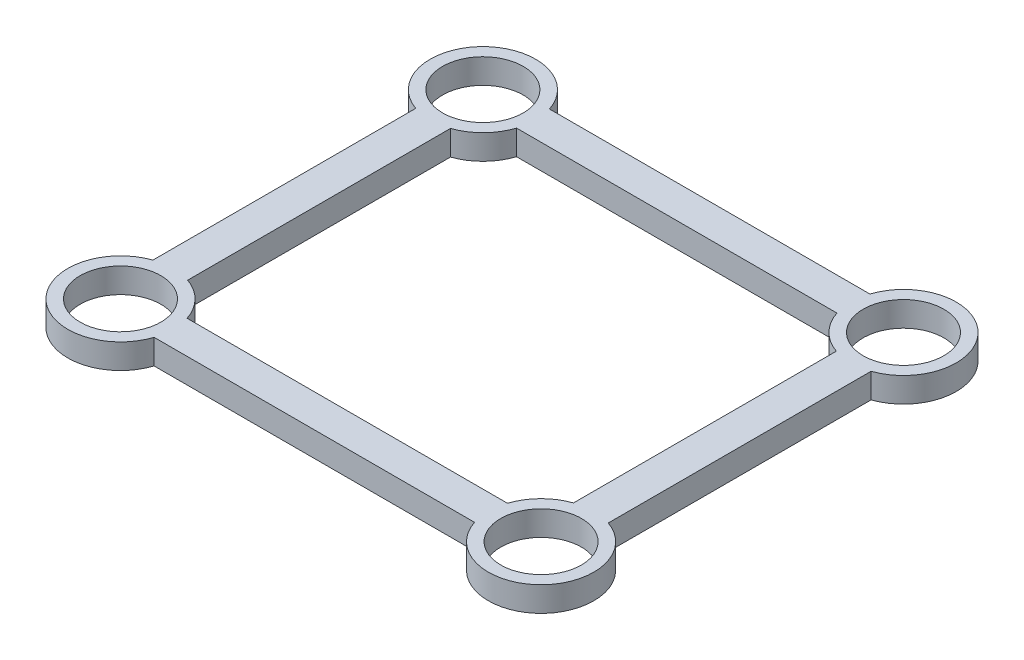
ISO-10303-21;
HEADER;
FILE_DESCRIPTION(('STEP AP214'),'2;1');
FILE_NAME('part.step','',(''),(''),'','','');
FILE_SCHEMA(('AUTOMOTIVE_DESIGN { 1 0 10303 214 1 1 1 1 }'));
ENDSEC;
DATA;
#1=APPLICATION_CONTEXT('core data for automotive mechanical design processes');
#2=APPLICATION_PROTOCOL_DEFINITION('international standard','automotive_design',2000,#1);
#3=PRODUCT_CONTEXT('',#1,'mechanical');
#4=PRODUCT('Part','Part','',(#3));
#5=PRODUCT_RELATED_PRODUCT_CATEGORY('part','',(#4));
#6=PRODUCT_DEFINITION_FORMATION('','',#4);
#7=PRODUCT_DEFINITION_CONTEXT('part definition',#1,'design');
#8=PRODUCT_DEFINITION('design','',#6,#7);
#9=PRODUCT_DEFINITION_SHAPE('','',#8);
#10=(LENGTH_UNIT() NAMED_UNIT(*) SI_UNIT(.MILLI.,.METRE.));
#11=(NAMED_UNIT(*) PLANE_ANGLE_UNIT() SI_UNIT($,.RADIAN.));
#12=(NAMED_UNIT(*) SI_UNIT($,.STERADIAN.) SOLID_ANGLE_UNIT());
#13=UNCERTAINTY_MEASURE_WITH_UNIT(LENGTH_MEASURE(1.E-05),#10,'distance_accuracy_value','');
#14=(GEOMETRIC_REPRESENTATION_CONTEXT(3) GLOBAL_UNCERTAINTY_ASSIGNED_CONTEXT((#13)) GLOBAL_UNIT_ASSIGNED_CONTEXT((#10,
#11,#12)) REPRESENTATION_CONTEXT('',''));
#15=CARTESIAN_POINT('',(0.,0.,0.));
#16=DIRECTION('',(0.,0.,1.));
#17=DIRECTION('',(1.,0.,0.));
#18=AXIS2_PLACEMENT_3D('',#15,#16,#17);
#19=CARTESIAN_POINT('',(-18.5199168614661,2.54,18.7952583208536));
#20=DIRECTION('',(0.,-1.,0.));
#21=DIRECTION('',(0.,0.,-1.));
#22=AXIS2_PLACEMENT_3D('',#19,#20,#21);
#23=CYLINDRICAL_SURFACE('',#22,5.3975);
#24=CARTESIAN_POINT('',(-18.5199168614661,0.,18.7952583208536));
#25=DIRECTION('',(0.,1.,0.));
#26=DIRECTION('',(0.,0.,1.));
#27=AXIS2_PLACEMENT_3D('',#24,#25,#26);
#28=CIRCLE('',#27,5.3975);
#29=CARTESIAN_POINT('',(-13.392735754035,0.,20.4819770708536));
#30=VERTEX_POINT('',#29);
#31=CARTESIAN_POINT('',(-20.298585882467,0.,13.699245883297));
#32=VERTEX_POINT('',#31);
#33=EDGE_CURVE('E233',#30,#32,#28,.F.);
#34=ORIENTED_EDGE('',*,*,#33,.F.);
#35=DIRECTION('',(0.,-1.,0.));
#36=VECTOR('',#35,1.);
#37=CARTESIAN_POINT('',(-13.392735754035,2.54,20.4819770708536));
#38=LINE('',#37,#36);
#39=CARTESIAN_POINT('',(-13.392735754035,2.54,20.4819770708536));
#40=VERTEX_POINT('',#39);
#41=EDGE_CURVE('E13',#40,#30,#38,.T.);
#42=ORIENTED_EDGE('',*,*,#41,.F.);
#43=CARTESIAN_POINT('',(-18.5199168614661,2.54,18.7952583208536));
#44=DIRECTION('',(0.,1.,0.));
#45=DIRECTION('',(0.,0.,1.));
#46=AXIS2_PLACEMENT_3D('',#43,#44,#45);
#47=CIRCLE('',#46,5.3975);
#48=CARTESIAN_POINT('',(-20.298585882467,2.54,13.699245883297));
#49=VERTEX_POINT('',#48);
#50=EDGE_CURVE('E324',#40,#49,#47,.F.);
#51=ORIENTED_EDGE('',*,*,#50,.T.);
#52=DIRECTION('',(0.,-1.,0.));
#53=VECTOR('',#52,1.);
#54=CARTESIAN_POINT('',(-20.298585882467,2.54,13.699245883297));
#55=LINE('',#54,#53);
#56=EDGE_CURVE('E123',#49,#32,#55,.T.);
#57=ORIENTED_EDGE('',*,*,#56,.T.);
#58=EDGE_LOOP('',(#34,#42,#51,#57));
#59=FACE_BOUND('',#58,.T.);
#60=ADVANCED_FACE('F45',(#59),#23,.T.);
#61=CARTESIAN_POINT('',(0.,2.54,20.4819770708536));
#62=DIRECTION('',(0.,0.,-1.));
#63=DIRECTION('',(-1.,0.,0.));
#64=AXIS2_PLACEMENT_3D('',#61,#62,#63);
#65=PLANE('',#64);
#66=DIRECTION('',(1.,0.,0.));
#67=VECTOR('',#66,1.);
#68=CARTESIAN_POINT('',(0.,0.,20.4819770708536));
#69=LINE('',#68,#67);
#70=CARTESIAN_POINT('',(19.3890567511028,0.,20.4819770708536));
#71=VERTEX_POINT('',#70);
#72=EDGE_CURVE('E235',#30,#71,#69,.T.);
#73=ORIENTED_EDGE('',*,*,#72,.T.);
#74=DIRECTION('',(0.,-1.,0.));
#75=VECTOR('',#74,1.);
#76=CARTESIAN_POINT('',(19.3890567511028,2.54,20.4819770708536));
#77=LINE('',#76,#75);
#78=CARTESIAN_POINT('',(19.3890567511028,2.54,20.4819770708536));
#79=VERTEX_POINT('',#78);
#80=EDGE_CURVE('E55',#79,#71,#77,.T.);
#81=ORIENTED_EDGE('',*,*,#80,.F.);
#82=DIRECTION('',(1.,0.,0.));
#83=VECTOR('',#82,1.);
#84=CARTESIAN_POINT('',(0.,2.54,20.4819770708536));
#85=LINE('',#84,#83);
#86=EDGE_CURVE('E326',#40,#79,#85,.T.);
#87=ORIENTED_EDGE('',*,*,#86,.F.);
#88=ORIENTED_EDGE('',*,*,#41,.T.);
#89=EDGE_LOOP('',(#73,#81,#87,#88));
#90=FACE_BOUND('',#89,.T.);
#91=ADVANCED_FACE('F362',(#90),#65,.F.);
#92=CARTESIAN_POINT('',(24.5162378585339,2.54,18.7952583208536));
#93=DIRECTION('',(0.,-1.,0.));
#94=DIRECTION('',(0.,0.,-1.));
#95=AXIS2_PLACEMENT_3D('',#92,#93,#94);
#96=CYLINDRICAL_SURFACE('',#95,5.3975);
#97=CARTESIAN_POINT('',(24.5162378585339,0.,18.7952583208536));
#98=DIRECTION('',(0.,1.,0.));
#99=DIRECTION('',(0.,0.,1.));
#100=AXIS2_PLACEMENT_3D('',#97,#98,#99);
#101=CIRCLE('',#100,5.3975);
#102=CARTESIAN_POINT('',(26.2949068795348,0.,13.699245883297));
#103=VERTEX_POINT('',#102);
#104=EDGE_CURVE('E238',#71,#103,#101,.T.);
#105=ORIENTED_EDGE('',*,*,#104,.T.);
#106=DIRECTION('',(0.,-1.,0.));
#107=VECTOR('',#106,1.);
#108=CARTESIAN_POINT('',(26.2949068795348,2.54,13.699245883297));
#109=LINE('',#108,#107);
#110=CARTESIAN_POINT('',(26.2949068795348,2.54,13.699245883297));
#111=VERTEX_POINT('',#110);
#112=EDGE_CURVE('E263',#111,#103,#109,.T.);
#113=ORIENTED_EDGE('',*,*,#112,.F.);
#114=CARTESIAN_POINT('',(24.5162378585339,2.54,18.7952583208536));
#115=DIRECTION('',(0.,1.,0.));
#116=DIRECTION('',(0.,0.,1.));
#117=AXIS2_PLACEMENT_3D('',#114,#115,#116);
#118=CIRCLE('',#117,5.3975);
#119=EDGE_CURVE('E329',#79,#111,#118,.T.);
#120=ORIENTED_EDGE('',*,*,#119,.F.);
#121=ORIENTED_EDGE('',*,*,#80,.T.);
#122=EDGE_LOOP('',(#105,#113,#120,#121));
#123=FACE_BOUND('',#122,.T.);
#124=ADVANCED_FACE('F367',(#123),#96,.T.);
#125=CARTESIAN_POINT('',(26.2949068795348,2.54,0.));
#126=DIRECTION('',(1.,0.,0.));
#127=DIRECTION('',(0.,0.,-1.));
#128=AXIS2_PLACEMENT_3D('',#125,#126,#127);
#129=PLANE('',#128);
#130=DIRECTION('',(0.,0.,1.));
#131=VECTOR('',#130,1.);
#132=CARTESIAN_POINT('',(26.2949068795348,0.,0.));
#133=LINE('',#132,#131);
#134=CARTESIAN_POINT('',(26.2949068795348,0.,-13.1927292415898));
#135=VERTEX_POINT('',#134);
#136=EDGE_CURVE('E241',#135,#103,#133,.T.);
#137=ORIENTED_EDGE('',*,*,#136,.F.);
#138=DIRECTION('',(0.,-1.,0.));
#139=VECTOR('',#138,1.);
#140=CARTESIAN_POINT('',(26.2949068795348,2.54,-13.1927292415898));
#141=LINE('',#140,#139);
#142=CARTESIAN_POINT('',(26.2949068795348,2.54,-13.1927292415898));
#143=VERTEX_POINT('',#142);
#144=EDGE_CURVE('E261',#143,#135,#141,.T.);
#145=ORIENTED_EDGE('',*,*,#144,.F.);
#146=DIRECTION('',(0.,0.,1.));
#147=VECTOR('',#146,1.);
#148=CARTESIAN_POINT('',(26.2949068795348,2.54,0.));
#149=LINE('',#148,#147);
#150=EDGE_CURVE('E193',#143,#111,#149,.T.);
#151=ORIENTED_EDGE('',*,*,#150,.T.);
#152=ORIENTED_EDGE('',*,*,#112,.T.);
#153=EDGE_LOOP('',(#137,#145,#151,#152));
#154=FACE_BOUND('',#153,.T.);
#155=ADVANCED_FACE('F333',(#154),#129,.T.);
#156=CARTESIAN_POINT('',(24.5162378585339,2.54,-18.2887416791464));
#157=DIRECTION('',(0.,-1.,0.));
#158=DIRECTION('',(0.,0.,-1.));
#159=AXIS2_PLACEMENT_3D('',#156,#157,#158);
#160=CYLINDRICAL_SURFACE('',#159,5.3975);
#161=CARTESIAN_POINT('',(24.5162378585339,0.,-18.2887416791464));
#162=DIRECTION('',(0.,1.,0.));
#163=DIRECTION('',(0.,0.,1.));
#164=AXIS2_PLACEMENT_3D('',#161,#162,#163);
#165=CIRCLE('',#164,5.3975);
#166=CARTESIAN_POINT('',(19.3890567511028,0.,-19.9754604291464));
#167=VERTEX_POINT('',#166);
#168=EDGE_CURVE('E244',#167,#135,#165,.F.);
#169=ORIENTED_EDGE('',*,*,#168,.F.);
#170=DIRECTION('',(0.,-1.,0.));
#171=VECTOR('',#170,1.);
#172=CARTESIAN_POINT('',(19.3890567511028,2.54,-19.9754604291464));
#173=LINE('',#172,#171);
#174=CARTESIAN_POINT('',(19.3890567511028,2.54,-19.9754604291464));
#175=VERTEX_POINT('',#174);
#176=EDGE_CURVE('E179',#175,#167,#173,.T.);
#177=ORIENTED_EDGE('',*,*,#176,.F.);
#178=CARTESIAN_POINT('',(24.5162378585339,2.54,-18.2887416791464));
#179=DIRECTION('',(0.,1.,0.));
#180=DIRECTION('',(0.,0.,1.));
#181=AXIS2_PLACEMENT_3D('',#178,#179,#180);
#182=CIRCLE('',#181,5.3975);
#183=EDGE_CURVE('E191',#175,#143,#182,.F.);
#184=ORIENTED_EDGE('',*,*,#183,.T.);
#185=ORIENTED_EDGE('',*,*,#144,.T.);
#186=EDGE_LOOP('',(#169,#177,#184,#185));
#187=FACE_BOUND('',#186,.T.);
#188=ADVANCED_FACE('F337',(#187),#160,.T.);
#189=CARTESIAN_POINT('',(0.,2.54,-19.9754604291464));
#190=DIRECTION('',(0.,0.,-1.));
#191=DIRECTION('',(-1.,0.,0.));
#192=AXIS2_PLACEMENT_3D('',#189,#190,#191);
#193=PLANE('',#192);
#194=DIRECTION('',(1.,0.,0.));
#195=VECTOR('',#194,1.);
#196=CARTESIAN_POINT('',(0.,0.,-19.9754604291464));
#197=LINE('',#196,#195);
#198=CARTESIAN_POINT('',(-13.392735754035,0.,-19.9754604291464));
#199=VERTEX_POINT('',#198);
#200=EDGE_CURVE('E176',#199,#167,#197,.T.);
#201=ORIENTED_EDGE('',*,*,#200,.F.);
#202=DIRECTION('',(0.,-1.,0.));
#203=VECTOR('',#202,1.);
#204=CARTESIAN_POINT('',(-13.392735754035,2.54,-19.9754604291464));
#205=LINE('',#204,#203);
#206=CARTESIAN_POINT('',(-13.392735754035,2.54,-19.9754604291464));
#207=VERTEX_POINT('',#206);
#208=EDGE_CURVE('E170',#207,#199,#205,.T.);
#209=ORIENTED_EDGE('',*,*,#208,.F.);
#210=DIRECTION('',(1.,0.,0.));
#211=VECTOR('',#210,1.);
#212=CARTESIAN_POINT('',(0.,2.54,-19.9754604291464));
#213=LINE('',#212,#211);
#214=EDGE_CURVE('E174',#207,#175,#213,.T.);
#215=ORIENTED_EDGE('',*,*,#214,.T.);
#216=ORIENTED_EDGE('',*,*,#176,.T.);
#217=EDGE_LOOP('',(#201,#209,#215,#216));
#218=FACE_BOUND('',#217,.T.);
#219=ADVANCED_FACE('F172',(#218),#193,.T.);
#220=CARTESIAN_POINT('',(-18.5199168614661,2.54,-18.2887416791464));
#221=DIRECTION('',(0.,-1.,0.));
#222=DIRECTION('',(0.,0.,-1.));
#223=AXIS2_PLACEMENT_3D('',#220,#221,#222);
#224=CYLINDRICAL_SURFACE('',#223,5.3975);
#225=CARTESIAN_POINT('',(-18.5199168614661,0.,-18.2887416791464));
#226=DIRECTION('',(0.,1.,0.));
#227=DIRECTION('',(0.,0.,1.));
#228=AXIS2_PLACEMENT_3D('',#225,#226,#227);
#229=CIRCLE('',#228,5.3975);
#230=CARTESIAN_POINT('',(-20.298585882467,0.,-13.1927292415898));
#231=VERTEX_POINT('',#230);
#232=EDGE_CURVE('E248',#199,#231,#229,.T.);
#233=ORIENTED_EDGE('',*,*,#232,.T.);
#234=DIRECTION('',(0.,-1.,0.));
#235=VECTOR('',#234,1.);
#236=CARTESIAN_POINT('',(-20.298585882467,2.54,-13.1927292415898));
#237=LINE('',#236,#235);
#238=CARTESIAN_POINT('',(-20.298585882467,2.54,-13.1927292415898));
#239=VERTEX_POINT('',#238);
#240=EDGE_CURVE('E180',#239,#231,#237,.T.);
#241=ORIENTED_EDGE('',*,*,#240,.F.);
#242=CARTESIAN_POINT('',(-18.5199168614661,2.54,-18.2887416791464));
#243=DIRECTION('',(0.,1.,0.));
#244=DIRECTION('',(0.,0.,1.));
#245=AXIS2_PLACEMENT_3D('',#242,#243,#244);
#246=CIRCLE('',#245,5.3975);
#247=EDGE_CURVE('E183',#207,#239,#246,.T.);
#248=ORIENTED_EDGE('',*,*,#247,.F.);
#249=ORIENTED_EDGE('',*,*,#208,.T.);
#250=EDGE_LOOP('',(#233,#241,#248,#249));
#251=FACE_BOUND('',#250,.T.);
#252=ADVANCED_FACE('F184',(#251),#224,.T.);
#253=CARTESIAN_POINT('',(-18.5199168614661,2.54,18.7952583208536));
#254=DIRECTION('',(0.,-1.,0.));
#255=DIRECTION('',(0.,0.,-1.));
#256=AXIS2_PLACEMENT_3D('',#253,#254,#255);
#257=CYLINDRICAL_SURFACE('',#256,5.3975);
#258=CARTESIAN_POINT('',(-18.5199168614661,0.,18.7952583208536));
#259=DIRECTION('',(0.,1.,0.));
#260=DIRECTION('',(0.,0.,1.));
#261=AXIS2_PLACEMENT_3D('',#258,#259,#260);
#262=CIRCLE('',#261,5.3975);
#263=CARTESIAN_POINT('',(-16.7412478404652,0.,13.699245883297));
#264=VERTEX_POINT('',#263);
#265=CARTESIAN_POINT('',(-13.392735754035,0.,17.1085395708536));
#266=VERTEX_POINT('',#265);
#267=EDGE_CURVE('E205',#264,#266,#262,.F.);
#268=ORIENTED_EDGE('',*,*,#267,.F.);
#269=DIRECTION('',(0.,-1.,0.));
#270=VECTOR('',#269,1.);
#271=CARTESIAN_POINT('',(-16.7412478404652,2.54,13.699245883297));
#272=LINE('',#271,#270);
#273=CARTESIAN_POINT('',(-16.7412478404652,2.54,13.699245883297));
#274=VERTEX_POINT('',#273);
#275=EDGE_CURVE('E49',#274,#264,#272,.T.);
#276=ORIENTED_EDGE('',*,*,#275,.F.);
#277=CARTESIAN_POINT('',(-18.5199168614661,2.54,18.7952583208536));
#278=DIRECTION('',(0.,1.,0.));
#279=DIRECTION('',(0.,0.,1.));
#280=AXIS2_PLACEMENT_3D('',#277,#278,#279);
#281=CIRCLE('',#280,5.3975);
#282=CARTESIAN_POINT('',(-13.392735754035,2.54,17.1085395708536));
#283=VERTEX_POINT('',#282);
#284=EDGE_CURVE('E257',#274,#283,#281,.F.);
#285=ORIENTED_EDGE('',*,*,#284,.T.);
#286=DIRECTION('',(0.,-1.,0.));
#287=VECTOR('',#286,1.);
#288=CARTESIAN_POINT('',(-13.392735754035,2.54,17.1085395708536));
#289=LINE('',#288,#287);
#290=EDGE_CURVE('E204',#283,#266,#289,.T.);
#291=ORIENTED_EDGE('',*,*,#290,.T.);
#292=EDGE_LOOP('',(#268,#276,#285,#291));
#293=FACE_BOUND('',#292,.T.);
#294=ADVANCED_FACE('F47',(#293),#257,.T.);
#295=CARTESIAN_POINT('',(-16.7412478404652,2.54,0.));
#296=DIRECTION('',(1.,0.,0.));
#297=DIRECTION('',(0.,0.,-1.));
#298=AXIS2_PLACEMENT_3D('',#295,#296,#297);
#299=PLANE('',#298);
#300=DIRECTION('',(0.,0.,1.));
#301=VECTOR('',#300,1.);
#302=CARTESIAN_POINT('',(-16.7412478404652,0.,0.));
#303=LINE('',#302,#301);
#304=CARTESIAN_POINT('',(-16.7412478404652,0.,-13.1927292415898));
#305=VERTEX_POINT('',#304);
#306=EDGE_CURVE('E208',#305,#264,#303,.T.);
#307=ORIENTED_EDGE('',*,*,#306,.F.);
#308=DIRECTION('',(0.,-1.,0.));
#309=VECTOR('',#308,1.);
#310=CARTESIAN_POINT('',(-16.7412478404652,2.54,-13.1927292415898));
#311=LINE('',#310,#309);
#312=CARTESIAN_POINT('',(-16.7412478404652,2.54,-13.1927292415898));
#313=VERTEX_POINT('',#312);
#314=EDGE_CURVE('E279',#313,#305,#311,.T.);
#315=ORIENTED_EDGE('',*,*,#314,.F.);
#316=DIRECTION('',(0.,0.,1.));
#317=VECTOR('',#316,1.);
#318=CARTESIAN_POINT('',(-16.7412478404652,2.54,0.));
#319=LINE('',#318,#317);
#320=EDGE_CURVE('E288',#313,#274,#319,.T.);
#321=ORIENTED_EDGE('',*,*,#320,.T.);
#322=ORIENTED_EDGE('',*,*,#275,.T.);
#323=EDGE_LOOP('',(#307,#315,#321,#322));
#324=FACE_BOUND('',#323,.T.);
#325=ADVANCED_FACE('F286',(#324),#299,.T.);
#326=CARTESIAN_POINT('',(-18.5199168614661,2.54,-18.2887416791464));
#327=DIRECTION('',(0.,-1.,0.));
#328=DIRECTION('',(0.,0.,-1.));
#329=AXIS2_PLACEMENT_3D('',#326,#327,#328);
#330=CYLINDRICAL_SURFACE('',#329,5.3975);
#331=CARTESIAN_POINT('',(-18.5199168614661,0.,-18.2887416791464));
#332=DIRECTION('',(0.,1.,0.));
#333=DIRECTION('',(0.,0.,1.));
#334=AXIS2_PLACEMENT_3D('',#331,#332,#333);
#335=CIRCLE('',#334,5.3975);
#336=CARTESIAN_POINT('',(-13.392735754035,0.,-16.6020229291464));
#337=VERTEX_POINT('',#336);
#338=EDGE_CURVE('E211',#305,#337,#335,.T.);
#339=ORIENTED_EDGE('',*,*,#338,.T.);
#340=DIRECTION('',(0.,-1.,0.));
#341=VECTOR('',#340,1.);
#342=CARTESIAN_POINT('',(-13.392735754035,2.54,-16.6020229291464));
#343=LINE('',#342,#341);
#344=CARTESIAN_POINT('',(-13.392735754035,2.54,-16.6020229291464));
#345=VERTEX_POINT('',#344);
#346=EDGE_CURVE('E277',#345,#337,#343,.T.);
#347=ORIENTED_EDGE('',*,*,#346,.F.);
#348=CARTESIAN_POINT('',(-18.5199168614661,2.54,-18.2887416791464));
#349=DIRECTION('',(0.,1.,0.));
#350=DIRECTION('',(0.,0.,1.));
#351=AXIS2_PLACEMENT_3D('',#348,#349,#350);
#352=CIRCLE('',#351,5.3975);
#353=EDGE_CURVE('E305',#313,#345,#352,.T.);
#354=ORIENTED_EDGE('',*,*,#353,.F.);
#355=ORIENTED_EDGE('',*,*,#314,.T.);
#356=EDGE_LOOP('',(#339,#347,#354,#355));
#357=FACE_BOUND('',#356,.T.);
#358=ADVANCED_FACE('F295',(#357),#330,.T.);
#359=CARTESIAN_POINT('',(0.,2.54,-16.6020229291464));
#360=DIRECTION('',(0.,0.,-1.));
#361=DIRECTION('',(-1.,0.,0.));
#362=AXIS2_PLACEMENT_3D('',#359,#360,#361);
#363=PLANE('',#362);
#364=DIRECTION('',(1.,0.,0.));
#365=VECTOR('',#364,1.);
#366=CARTESIAN_POINT('',(0.,0.,-16.6020229291464));
#367=LINE('',#366,#365);
#368=CARTESIAN_POINT('',(19.3890567511028,0.,-16.6020229291464));
#369=VERTEX_POINT('',#368);
#370=EDGE_CURVE('E213',#337,#369,#367,.T.);
#371=ORIENTED_EDGE('',*,*,#370,.T.);
#372=DIRECTION('',(0.,-1.,0.));
#373=VECTOR('',#372,1.);
#374=CARTESIAN_POINT('',(19.3890567511028,2.54,-16.6020229291464));
#375=LINE('',#374,#373);
#376=CARTESIAN_POINT('',(19.3890567511028,2.54,-16.6020229291464));
#377=VERTEX_POINT('',#376);
#378=EDGE_CURVE('E275',#377,#369,#375,.T.);
#379=ORIENTED_EDGE('',*,*,#378,.F.);
#380=DIRECTION('',(1.,0.,0.));
#381=VECTOR('',#380,1.);
#382=CARTESIAN_POINT('',(0.,2.54,-16.6020229291464));
#383=LINE('',#382,#381);
#384=EDGE_CURVE('E300',#345,#377,#383,.T.);
#385=ORIENTED_EDGE('',*,*,#384,.F.);
#386=ORIENTED_EDGE('',*,*,#346,.T.);
#387=EDGE_LOOP('',(#371,#379,#385,#386));
#388=FACE_BOUND('',#387,.T.);
#389=ADVANCED_FACE('F298',(#388),#363,.F.);
#390=CARTESIAN_POINT('',(24.5162378585339,2.54,-18.2887416791464));
#391=DIRECTION('',(0.,-1.,0.));
#392=DIRECTION('',(0.,0.,-1.));
#393=AXIS2_PLACEMENT_3D('',#390,#391,#392);
#394=CYLINDRICAL_SURFACE('',#393,5.3975);
#395=CARTESIAN_POINT('',(24.5162378585339,0.,-18.2887416791464));
#396=DIRECTION('',(0.,1.,0.));
#397=DIRECTION('',(0.,0.,1.));
#398=AXIS2_PLACEMENT_3D('',#395,#396,#397);
#399=CIRCLE('',#398,5.3975);
#400=CARTESIAN_POINT('',(22.737568837533,0.,-13.1927292415898));
#401=VERTEX_POINT('',#400);
#402=EDGE_CURVE('E216',#401,#369,#399,.F.);
#403=ORIENTED_EDGE('',*,*,#402,.F.);
#404=DIRECTION('',(0.,-1.,0.));
#405=VECTOR('',#404,1.);
#406=CARTESIAN_POINT('',(22.737568837533,2.54,-13.1927292415898));
#407=LINE('',#406,#405);
#408=CARTESIAN_POINT('',(22.737568837533,2.54,-13.1927292415898));
#409=VERTEX_POINT('',#408);
#410=EDGE_CURVE('E273',#409,#401,#407,.T.);
#411=ORIENTED_EDGE('',*,*,#410,.F.);
#412=CARTESIAN_POINT('',(24.5162378585339,2.54,-18.2887416791464));
#413=DIRECTION('',(0.,1.,0.));
#414=DIRECTION('',(0.,0.,1.));
#415=AXIS2_PLACEMENT_3D('',#412,#413,#414);
#416=CIRCLE('',#415,5.3975);
#417=EDGE_CURVE('E304',#409,#377,#416,.F.);
#418=ORIENTED_EDGE('',*,*,#417,.T.);
#419=ORIENTED_EDGE('',*,*,#378,.T.);
#420=EDGE_LOOP('',(#403,#411,#418,#419));
#421=FACE_BOUND('',#420,.T.);
#422=ADVANCED_FACE('F388',(#421),#394,.T.);
#423=CARTESIAN_POINT('',(22.737568837533,2.54,0.));
#424=DIRECTION('',(1.,0.,0.));
#425=DIRECTION('',(0.,0.,-1.));
#426=AXIS2_PLACEMENT_3D('',#423,#424,#425);
#427=PLANE('',#426);
#428=DIRECTION('',(0.,0.,1.));
#429=VECTOR('',#428,1.);
#430=CARTESIAN_POINT('',(22.737568837533,0.,0.));
#431=LINE('',#430,#429);
#432=CARTESIAN_POINT('',(22.737568837533,0.,13.699245883297));
#433=VERTEX_POINT('',#432);
#434=EDGE_CURVE('E219',#401,#433,#431,.T.);
#435=ORIENTED_EDGE('',*,*,#434,.T.);
#436=DIRECTION('',(0.,-1.,0.));
#437=VECTOR('',#436,1.);
#438=CARTESIAN_POINT('',(22.737568837533,2.54,13.699245883297));
#439=LINE('',#438,#437);
#440=CARTESIAN_POINT('',(22.737568837533,2.54,13.699245883297));
#441=VERTEX_POINT('',#440);
#442=EDGE_CURVE('E270',#441,#433,#439,.T.);
#443=ORIENTED_EDGE('',*,*,#442,.F.);
#444=DIRECTION('',(0.,0.,1.));
#445=VECTOR('',#444,1.);
#446=CARTESIAN_POINT('',(22.737568837533,2.54,0.));
#447=LINE('',#446,#445);
#448=EDGE_CURVE('E307',#409,#441,#447,.T.);
#449=ORIENTED_EDGE('',*,*,#448,.F.);
#450=ORIENTED_EDGE('',*,*,#410,.T.);
#451=EDGE_LOOP('',(#435,#443,#449,#450));
#452=FACE_BOUND('',#451,.T.);
#453=ADVANCED_FACE('F384',(#452),#427,.F.);
#454=CARTESIAN_POINT('',(24.5162378585339,2.54,18.7952583208536));
#455=DIRECTION('',(0.,-1.,0.));
#456=DIRECTION('',(0.,0.,-1.));
#457=AXIS2_PLACEMENT_3D('',#454,#455,#456);
#458=CYLINDRICAL_SURFACE('',#457,5.3975);
#459=CARTESIAN_POINT('',(24.5162378585339,0.,18.7952583208536));
#460=DIRECTION('',(0.,1.,0.));
#461=DIRECTION('',(0.,0.,1.));
#462=AXIS2_PLACEMENT_3D('',#459,#460,#461);
#463=CIRCLE('',#462,5.3975);
#464=CARTESIAN_POINT('',(19.3890567511028,0.,17.1085395708536));
#465=VERTEX_POINT('',#464);
#466=EDGE_CURVE('E221',#433,#465,#463,.T.);
#467=ORIENTED_EDGE('',*,*,#466,.T.);
#468=DIRECTION('',(0.,-1.,0.));
#469=VECTOR('',#468,1.);
#470=CARTESIAN_POINT('',(19.3890567511028,2.54,17.1085395708536));
#471=LINE('',#470,#469);
#472=CARTESIAN_POINT('',(19.3890567511028,2.54,17.1085395708536));
#473=VERTEX_POINT('',#472);
#474=EDGE_CURVE('E268',#473,#465,#471,.T.);
#475=ORIENTED_EDGE('',*,*,#474,.F.);
#476=CARTESIAN_POINT('',(24.5162378585339,2.54,18.7952583208536));
#477=DIRECTION('',(0.,1.,0.));
#478=DIRECTION('',(0.,0.,1.));
#479=AXIS2_PLACEMENT_3D('',#476,#477,#478);
#480=CIRCLE('',#479,5.3975);
#481=EDGE_CURVE('E313',#441,#473,#480,.T.);
#482=ORIENTED_EDGE('',*,*,#481,.F.);
#483=ORIENTED_EDGE('',*,*,#442,.T.);
#484=EDGE_LOOP('',(#467,#475,#482,#483));
#485=FACE_BOUND('',#484,.T.);
#486=ADVANCED_FACE('F380',(#485),#458,.T.);
#487=CARTESIAN_POINT('',(24.5162378585339,2.54,-18.2887416791464));
#488=DIRECTION('',(0.,-1.,0.));
#489=DIRECTION('',(0.,0.,-1.));
#490=AXIS2_PLACEMENT_3D('',#487,#488,#489);
#491=CYLINDRICAL_SURFACE('',#490,4.1275);
#492=CARTESIAN_POINT('',(24.5162378585339,2.54,-18.2887416791464));
#493=DIRECTION('',(0.,1.,0.));
#494=DIRECTION('',(0.,0.,1.));
#495=AXIS2_PLACEMENT_3D('',#492,#493,#494);
#496=CIRCLE('',#495,4.1275);
#497=CARTESIAN_POINT('',(24.5162378585339,2.54,-14.1612416791464));
#498=VERTEX_POINT('',#497);
#499=EDGE_CURVE('E198',#498,#498,#496,.F.);
#500=ORIENTED_EDGE('',*,*,#499,.F.);
#501=EDGE_LOOP('',(#500));
#502=FACE_BOUND('',#501,.T.);
#503=CARTESIAN_POINT('',(24.5162378585339,0.,-18.2887416791464));
#504=DIRECTION('',(0.,1.,0.));
#505=DIRECTION('',(0.,0.,1.));
#506=AXIS2_PLACEMENT_3D('',#503,#504,#505);
#507=CIRCLE('',#506,4.1275);
#508=CARTESIAN_POINT('',(24.5162378585339,0.,-14.1612416791464));
#509=VERTEX_POINT('',#508);
#510=EDGE_CURVE('E251',#509,#509,#507,.F.);
#511=ORIENTED_EDGE('',*,*,#510,.T.);
#512=EDGE_LOOP('',(#511));
#513=FACE_BOUND('',#512,.T.);
#514=ADVANCED_FACE('F383',(#502,#513),#491,.F.);
#515=CARTESIAN_POINT('',(-20.298585882467,2.54,0.));
#516=DIRECTION('',(1.,0.,0.));
#517=DIRECTION('',(0.,0.,-1.));
#518=AXIS2_PLACEMENT_3D('',#515,#516,#517);
#519=PLANE('',#518);
#520=DIRECTION('',(0.,0.,1.));
#521=VECTOR('',#520,1.);
#522=CARTESIAN_POINT('',(-20.298585882467,0.,0.));
#523=LINE('',#522,#521);
#524=EDGE_CURVE('E116',#231,#32,#523,.T.);
#525=ORIENTED_EDGE('',*,*,#524,.T.);
#526=ORIENTED_EDGE('',*,*,#56,.F.);
#527=DIRECTION('',(0.,0.,1.));
#528=VECTOR('',#527,1.);
#529=CARTESIAN_POINT('',(-20.298585882467,2.54,0.));
#530=LINE('',#529,#528);
#531=EDGE_CURVE('E64',#239,#49,#530,.T.);
#532=ORIENTED_EDGE('',*,*,#531,.F.);
#533=ORIENTED_EDGE('',*,*,#240,.T.);
#534=EDGE_LOOP('',(#525,#526,#532,#533));
#535=FACE_BOUND('',#534,.T.);
#536=ADVANCED_FACE('F375',(#535),#519,.F.);
#537=CARTESIAN_POINT('',(-18.5199168614661,2.54,-18.2887416791464));
#538=DIRECTION('',(0.,-1.,0.));
#539=DIRECTION('',(0.,0.,-1.));
#540=AXIS2_PLACEMENT_3D('',#537,#538,#539);
#541=CYLINDRICAL_SURFACE('',#540,4.1275);
#542=CARTESIAN_POINT('',(-18.5199168614661,2.54,-18.2887416791464));
#543=DIRECTION('',(0.,1.,0.));
#544=DIRECTION('',(0.,0.,1.));
#545=AXIS2_PLACEMENT_3D('',#542,#543,#544);
#546=CIRCLE('',#545,4.1275);
#547=CARTESIAN_POINT('',(-18.5199168614661,2.54,-14.1612416791464));
#548=VERTEX_POINT('',#547);
#549=EDGE_CURVE('E321',#548,#548,#546,.T.);
#550=ORIENTED_EDGE('',*,*,#549,.T.);
#551=EDGE_LOOP('',(#550));
#552=FACE_BOUND('',#551,.T.);
#553=CARTESIAN_POINT('',(-18.5199168614661,0.,-18.2887416791464));
#554=DIRECTION('',(0.,1.,0.));
#555=DIRECTION('',(0.,0.,1.));
#556=AXIS2_PLACEMENT_3D('',#553,#554,#555);
#557=CIRCLE('',#556,4.1275);
#558=CARTESIAN_POINT('',(-18.5199168614661,0.,-14.1612416791464));
#559=VERTEX_POINT('',#558);
#560=EDGE_CURVE('E230',#559,#559,#557,.T.);
#561=ORIENTED_EDGE('',*,*,#560,.F.);
#562=EDGE_LOOP('',(#561));
#563=FACE_BOUND('',#562,.T.);
#564=ADVANCED_FACE('F372',(#552,#563),#541,.F.);
#565=CARTESIAN_POINT('',(24.5162378585339,2.54,18.7952583208536));
#566=DIRECTION('',(0.,-1.,0.));
#567=DIRECTION('',(0.,0.,-1.));
#568=AXIS2_PLACEMENT_3D('',#565,#566,#567);
#569=CYLINDRICAL_SURFACE('',#568,4.1275);
#570=CARTESIAN_POINT('',(24.5162378585339,2.54,18.7952583208536));
#571=DIRECTION('',(0.,1.,0.));
#572=DIRECTION('',(0.,0.,1.));
#573=AXIS2_PLACEMENT_3D('',#570,#571,#572);
#574=CIRCLE('',#573,4.1275);
#575=CARTESIAN_POINT('',(24.5162378585339,2.54,22.9227583208536));
#576=VERTEX_POINT('',#575);
#577=EDGE_CURVE('E318',#576,#576,#574,.T.);
#578=ORIENTED_EDGE('',*,*,#577,.T.);
#579=EDGE_LOOP('',(#578));
#580=FACE_BOUND('',#579,.T.);
#581=CARTESIAN_POINT('',(24.5162378585339,0.,18.7952583208536));
#582=DIRECTION('',(0.,1.,0.));
#583=DIRECTION('',(0.,0.,1.));
#584=AXIS2_PLACEMENT_3D('',#581,#582,#583);
#585=CIRCLE('',#584,4.1275);
#586=CARTESIAN_POINT('',(24.5162378585339,0.,22.9227583208536));
#587=VERTEX_POINT('',#586);
#588=EDGE_CURVE('E227',#587,#587,#585,.T.);
#589=ORIENTED_EDGE('',*,*,#588,.F.);
#590=EDGE_LOOP('',(#589));
#591=FACE_BOUND('',#590,.T.);
#592=ADVANCED_FACE('F356',(#580,#591),#569,.F.);
#593=CARTESIAN_POINT('',(0.,2.54,17.1085395708536));
#594=DIRECTION('',(0.,0.,-1.));
#595=DIRECTION('',(-1.,0.,0.));
#596=AXIS2_PLACEMENT_3D('',#593,#594,#595);
#597=PLANE('',#596);
#598=DIRECTION('',(1.,0.,0.));
#599=VECTOR('',#598,1.);
#600=CARTESIAN_POINT('',(0.,0.,17.1085395708536));
#601=LINE('',#600,#599);
#602=EDGE_CURVE('E224',#266,#465,#601,.T.);
#603=ORIENTED_EDGE('',*,*,#602,.F.);
#604=ORIENTED_EDGE('',*,*,#290,.F.);
#605=DIRECTION('',(1.,0.,0.));
#606=VECTOR('',#605,1.);
#607=CARTESIAN_POINT('',(0.,2.54,17.1085395708536));
#608=LINE('',#607,#606);
#609=EDGE_CURVE('E315',#283,#473,#608,.T.);
#610=ORIENTED_EDGE('',*,*,#609,.T.);
#611=ORIENTED_EDGE('',*,*,#474,.T.);
#612=EDGE_LOOP('',(#603,#604,#610,#611));
#613=FACE_BOUND('',#612,.T.);
#614=ADVANCED_FACE('F348',(#613),#597,.T.);
#615=CARTESIAN_POINT('',(-18.5199168614661,2.54,18.7952583208536));
#616=DIRECTION('',(0.,-1.,0.));
#617=DIRECTION('',(0.,0.,-1.));
#618=AXIS2_PLACEMENT_3D('',#615,#616,#617);
#619=CYLINDRICAL_SURFACE('',#618,4.1275);
#620=CARTESIAN_POINT('',(-18.5199168614661,2.54,18.7952583208536));
#621=DIRECTION('',(0.,1.,0.));
#622=DIRECTION('',(0.,0.,1.));
#623=AXIS2_PLACEMENT_3D('',#620,#621,#622);
#624=CIRCLE('',#623,4.1275);
#625=CARTESIAN_POINT('',(-18.5199168614661,2.54,22.9227583208536));
#626=VERTEX_POINT('',#625);
#627=EDGE_CURVE('E201',#626,#626,#624,.F.);
#628=ORIENTED_EDGE('',*,*,#627,.F.);
#629=EDGE_LOOP('',(#628));
#630=FACE_BOUND('',#629,.T.);
#631=CARTESIAN_POINT('',(-18.5199168614661,0.,18.7952583208536));
#632=DIRECTION('',(0.,1.,0.));
#633=DIRECTION('',(0.,0.,1.));
#634=AXIS2_PLACEMENT_3D('',#631,#632,#633);
#635=CIRCLE('',#634,4.1275);
#636=CARTESIAN_POINT('',(-18.5199168614661,0.,22.9227583208536));
#637=VERTEX_POINT('',#636);
#638=EDGE_CURVE('E254',#637,#637,#635,.F.);
#639=ORIENTED_EDGE('',*,*,#638,.T.);
#640=EDGE_LOOP('',(#639));
#641=FACE_BOUND('',#640,.T.);
#642=ADVANCED_FACE('F346',(#630,#641),#619,.F.);
#643=CARTESIAN_POINT('',(0.,2.54,0.));
#644=DIRECTION('',(0.,1.,0.));
#645=DIRECTION('',(0.,0.,1.));
#646=AXIS2_PLACEMENT_3D('',#643,#644,#645);
#647=PLANE('',#646);
#648=ORIENTED_EDGE('',*,*,#284,.F.);
#649=ORIENTED_EDGE('',*,*,#320,.F.);
#650=ORIENTED_EDGE('',*,*,#353,.T.);
#651=ORIENTED_EDGE('',*,*,#384,.T.);
#652=ORIENTED_EDGE('',*,*,#417,.F.);
#653=ORIENTED_EDGE('',*,*,#448,.T.);
#654=ORIENTED_EDGE('',*,*,#481,.T.);
#655=ORIENTED_EDGE('',*,*,#609,.F.);
#656=EDGE_LOOP('',(#648,#649,#650,#651,#652,#653,#654,#655));
#657=FACE_BOUND('',#656,.T.);
#658=ORIENTED_EDGE('',*,*,#577,.F.);
#659=EDGE_LOOP('',(#658));
#660=FACE_BOUND('',#659,.T.);
#661=ORIENTED_EDGE('',*,*,#549,.F.);
#662=EDGE_LOOP('',(#661));
#663=FACE_BOUND('',#662,.T.);
#664=ORIENTED_EDGE('',*,*,#50,.F.);
#665=ORIENTED_EDGE('',*,*,#86,.T.);
#666=ORIENTED_EDGE('',*,*,#119,.T.);
#667=ORIENTED_EDGE('',*,*,#150,.F.);
#668=ORIENTED_EDGE('',*,*,#183,.F.);
#669=ORIENTED_EDGE('',*,*,#214,.F.);
#670=ORIENTED_EDGE('',*,*,#247,.T.);
#671=ORIENTED_EDGE('',*,*,#531,.T.);
#672=EDGE_LOOP('',(#664,#665,#666,#667,#668,#669,#670,#671));
#673=FACE_BOUND('',#672,.T.);
#674=ORIENTED_EDGE('',*,*,#499,.T.);
#675=EDGE_LOOP('',(#674));
#676=FACE_BOUND('',#675,.T.);
#677=ORIENTED_EDGE('',*,*,#627,.T.);
#678=EDGE_LOOP('',(#677));
#679=FACE_BOUND('',#678,.T.);
#680=ADVANCED_FACE('F187',(#657,#660,#663,#673,#676,#679),#647,.T.);
#681=CARTESIAN_POINT('',(0.,0.,0.));
#682=DIRECTION('',(0.,1.,0.));
#683=DIRECTION('',(0.,0.,1.));
#684=AXIS2_PLACEMENT_3D('',#681,#682,#683);
#685=PLANE('',#684);
#686=ORIENTED_EDGE('',*,*,#267,.T.);
#687=ORIENTED_EDGE('',*,*,#602,.T.);
#688=ORIENTED_EDGE('',*,*,#466,.F.);
#689=ORIENTED_EDGE('',*,*,#434,.F.);
#690=ORIENTED_EDGE('',*,*,#402,.T.);
#691=ORIENTED_EDGE('',*,*,#370,.F.);
#692=ORIENTED_EDGE('',*,*,#338,.F.);
#693=ORIENTED_EDGE('',*,*,#306,.T.);
#694=EDGE_LOOP('',(#686,#687,#688,#689,#690,#691,#692,#693));
#695=FACE_BOUND('',#694,.T.);
#696=ORIENTED_EDGE('',*,*,#588,.T.);
#697=EDGE_LOOP('',(#696));
#698=FACE_BOUND('',#697,.T.);
#699=ORIENTED_EDGE('',*,*,#560,.T.);
#700=EDGE_LOOP('',(#699));
#701=FACE_BOUND('',#700,.T.);
#702=ORIENTED_EDGE('',*,*,#33,.T.);
#703=ORIENTED_EDGE('',*,*,#524,.F.);
#704=ORIENTED_EDGE('',*,*,#232,.F.);
#705=ORIENTED_EDGE('',*,*,#200,.T.);
#706=ORIENTED_EDGE('',*,*,#168,.T.);
#707=ORIENTED_EDGE('',*,*,#136,.T.);
#708=ORIENTED_EDGE('',*,*,#104,.F.);
#709=ORIENTED_EDGE('',*,*,#72,.F.);
#710=EDGE_LOOP('',(#702,#703,#704,#705,#706,#707,#708,#709));
#711=FACE_BOUND('',#710,.T.);
#712=ORIENTED_EDGE('',*,*,#510,.F.);
#713=EDGE_LOOP('',(#712));
#714=FACE_BOUND('',#713,.T.);
#715=ORIENTED_EDGE('',*,*,#638,.F.);
#716=EDGE_LOOP('',(#715));
#717=FACE_BOUND('',#716,.T.);
#718=ADVANCED_FACE('F291',(#695,#698,#701,#711,#714,#717),#685,.F.);
#719=CLOSED_SHELL('',(#60,#91,#124,#155,#188,#219,#252,#294,#325,#358,#389,#422,#453,#486,#514,
#536,#564,#592,#614,#642,#680,#718));
#720=MANIFOLD_SOLID_BREP('B2',#719);
#721=ADVANCED_BREP_SHAPE_REPRESENTATION('',(#18,#720),#14);
#722=SHAPE_DEFINITION_REPRESENTATION(#9,#721);
ENDSEC;
END-ISO-10303-21;
